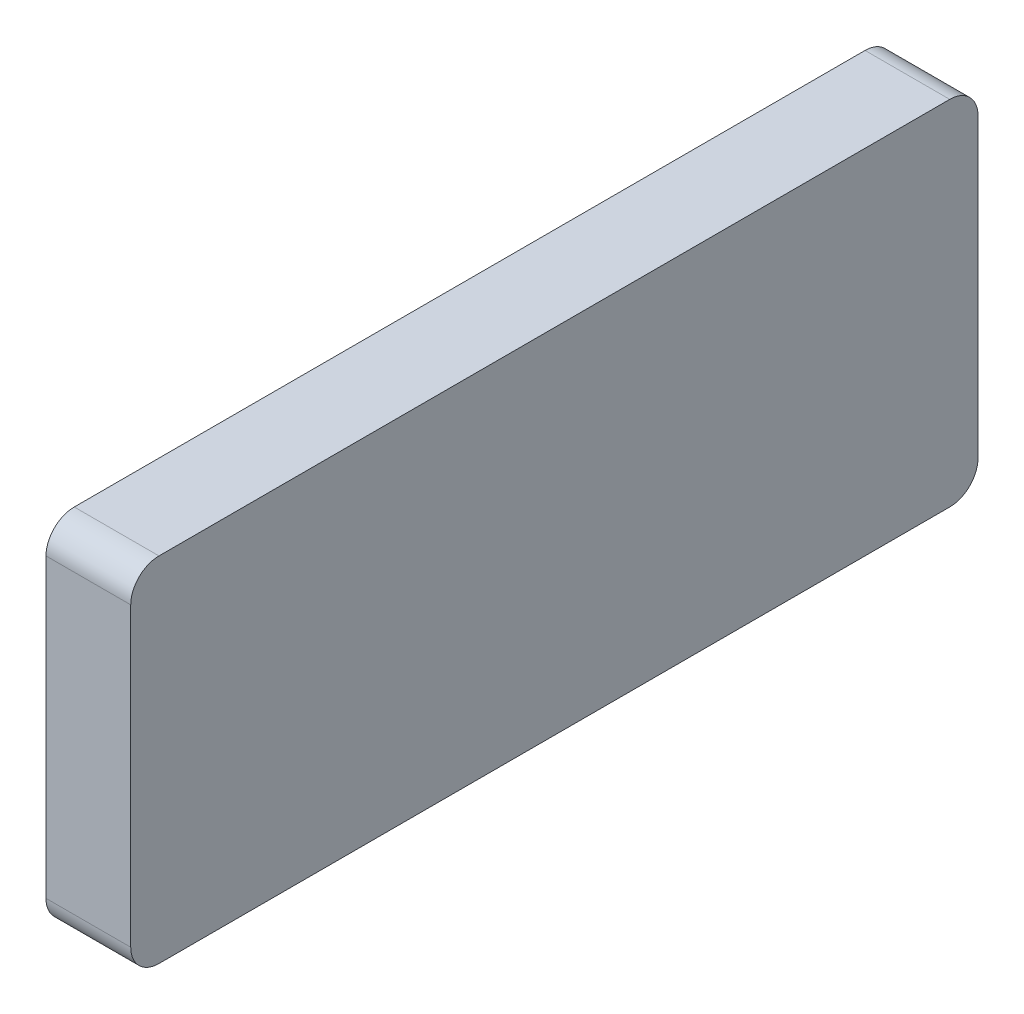
ISO-10303-21;
HEADER;
FILE_DESCRIPTION(('STEP AP214'),'2;1');
FILE_NAME('part.step','',(''),(''),'','','');
FILE_SCHEMA(('AUTOMOTIVE_DESIGN { 1 0 10303 214 1 1 1 1 }'));
ENDSEC;
DATA;
#1=APPLICATION_CONTEXT('core data for automotive mechanical design processes');
#2=APPLICATION_PROTOCOL_DEFINITION('international standard','automotive_design',2000,#1);
#3=PRODUCT_CONTEXT('',#1,'mechanical');
#4=PRODUCT('Part','Part','',(#3));
#5=PRODUCT_RELATED_PRODUCT_CATEGORY('part','',(#4));
#6=PRODUCT_DEFINITION_FORMATION('','',#4);
#7=PRODUCT_DEFINITION_CONTEXT('part definition',#1,'design');
#8=PRODUCT_DEFINITION('design','',#6,#7);
#9=PRODUCT_DEFINITION_SHAPE('','',#8);
#10=(LENGTH_UNIT() NAMED_UNIT(*) SI_UNIT(.MILLI.,.METRE.));
#11=(NAMED_UNIT(*) PLANE_ANGLE_UNIT() SI_UNIT($,.RADIAN.));
#12=(NAMED_UNIT(*) SI_UNIT($,.STERADIAN.) SOLID_ANGLE_UNIT());
#13=UNCERTAINTY_MEASURE_WITH_UNIT(LENGTH_MEASURE(1.E-05),#10,'distance_accuracy_value','');
#14=(GEOMETRIC_REPRESENTATION_CONTEXT(3) GLOBAL_UNCERTAINTY_ASSIGNED_CONTEXT((#13)) GLOBAL_UNIT_ASSIGNED_CONTEXT((#10,
#11,#12)) REPRESENTATION_CONTEXT('',''));
#15=CARTESIAN_POINT('',(0.,0.,0.));
#16=DIRECTION('',(0.,0.,1.));
#17=DIRECTION('',(1.,0.,0.));
#18=AXIS2_PLACEMENT_3D('',#15,#16,#17);
#19=CARTESIAN_POINT('',(6.,25.,0.));
#20=DIRECTION('',(0.,0.,-1.));
#21=DIRECTION('',(0.,1.,0.));
#22=AXIS2_PLACEMENT_3D('',#19,#20,#21);
#23=PLANE('',#22);
#24=DIRECTION('',(0.,-1.,0.));
#25=VECTOR('',#24,1.);
#26=CARTESIAN_POINT('',(0.,25.,0.));
#27=LINE('',#26,#25);
#28=CARTESIAN_POINT('',(0.,23.,0.));
#29=VERTEX_POINT('',#28);
#30=CARTESIAN_POINT('',(0.,2.,0.));
#31=VERTEX_POINT('',#30);
#32=EDGE_CURVE('E125',#29,#31,#27,.T.);
#33=ORIENTED_EDGE('',*,*,#32,.T.);
#34=DIRECTION('',(-1.,0.,0.));
#35=VECTOR('',#34,1.);
#36=CARTESIAN_POINT('',(6.,2.,0.));
#37=LINE('',#36,#35);
#38=CARTESIAN_POINT('',(6.,2.,0.));
#39=VERTEX_POINT('',#38);
#40=EDGE_CURVE('E103',#31,#39,#37,.F.);
#41=ORIENTED_EDGE('',*,*,#40,.T.);
#42=DIRECTION('',(0.,-1.,0.));
#43=VECTOR('',#42,1.);
#44=CARTESIAN_POINT('',(6.,25.,0.));
#45=LINE('',#44,#43);
#46=CARTESIAN_POINT('',(6.,23.,0.));
#47=VERTEX_POINT('',#46);
#48=EDGE_CURVE('E134',#47,#39,#45,.T.);
#49=ORIENTED_EDGE('',*,*,#48,.F.);
#50=DIRECTION('',(-1.,0.,0.));
#51=VECTOR('',#50,1.);
#52=CARTESIAN_POINT('',(6.,23.,0.));
#53=LINE('',#52,#51);
#54=EDGE_CURVE('E108',#47,#29,#53,.T.);
#55=ORIENTED_EDGE('',*,*,#54,.T.);
#56=EDGE_LOOP('',(#33,#41,#49,#55));
#57=FACE_BOUND('',#56,.T.);
#58=ADVANCED_FACE('F32',(#57),#23,.F.);
#59=CARTESIAN_POINT('',(6.,0.,0.));
#60=DIRECTION('',(0.,1.,0.));
#61=DIRECTION('',(0.,0.,1.));
#62=AXIS2_PLACEMENT_3D('',#59,#60,#61);
#63=PLANE('',#62);
#64=DIRECTION('',(0.,0.,-1.));
#65=VECTOR('',#64,1.);
#66=CARTESIAN_POINT('',(6.,0.,0.));
#67=LINE('',#66,#65);
#68=CARTESIAN_POINT('',(6.,0.,-2.));
#69=VERTEX_POINT('',#68);
#70=CARTESIAN_POINT('',(6.,0.,-58.));
#71=VERTEX_POINT('',#70);
#72=EDGE_CURVE('E118',#69,#71,#67,.T.);
#73=ORIENTED_EDGE('',*,*,#72,.F.);
#74=DIRECTION('',(-1.,0.,0.));
#75=VECTOR('',#74,1.);
#76=CARTESIAN_POINT('',(6.,0.,-2.));
#77=LINE('',#76,#75);
#78=CARTESIAN_POINT('',(0.,0.,-2.));
#79=VERTEX_POINT('',#78);
#80=EDGE_CURVE('E102',#69,#79,#77,.T.);
#81=ORIENTED_EDGE('',*,*,#80,.T.);
#82=DIRECTION('',(0.,0.,-1.));
#83=VECTOR('',#82,1.);
#84=CARTESIAN_POINT('',(0.,0.,0.));
#85=LINE('',#84,#83);
#86=CARTESIAN_POINT('',(0.,0.,-58.));
#87=VERTEX_POINT('',#86);
#88=EDGE_CURVE('E115',#79,#87,#85,.T.);
#89=ORIENTED_EDGE('',*,*,#88,.T.);
#90=DIRECTION('',(-1.,0.,0.));
#91=VECTOR('',#90,1.);
#92=CARTESIAN_POINT('',(6.,0.,-58.));
#93=LINE('',#92,#91);
#94=EDGE_CURVE('E120',#87,#71,#93,.F.);
#95=ORIENTED_EDGE('',*,*,#94,.T.);
#96=EDGE_LOOP('',(#73,#81,#89,#95));
#97=FACE_BOUND('',#96,.T.);
#98=ADVANCED_FACE('F114',(#97),#63,.F.);
#99=CARTESIAN_POINT('',(6.,0.,-60.));
#100=DIRECTION('',(0.,0.,1.));
#101=DIRECTION('',(1.,0.,0.));
#102=AXIS2_PLACEMENT_3D('',#99,#100,#101);
#103=PLANE('',#102);
#104=DIRECTION('',(0.,1.,0.));
#105=VECTOR('',#104,1.);
#106=CARTESIAN_POINT('',(6.,0.,-60.));
#107=LINE('',#106,#105);
#108=CARTESIAN_POINT('',(6.,2.,-60.));
#109=VERTEX_POINT('',#108);
#110=CARTESIAN_POINT('',(6.,23.,-60.));
#111=VERTEX_POINT('',#110);
#112=EDGE_CURVE('E160',#109,#111,#107,.T.);
#113=ORIENTED_EDGE('',*,*,#112,.F.);
#114=DIRECTION('',(-1.,0.,0.));
#115=VECTOR('',#114,1.);
#116=CARTESIAN_POINT('',(6.,2.,-60.));
#117=LINE('',#116,#115);
#118=CARTESIAN_POINT('',(0.,2.,-60.));
#119=VERTEX_POINT('',#118);
#120=EDGE_CURVE('E153',#109,#119,#117,.T.);
#121=ORIENTED_EDGE('',*,*,#120,.T.);
#122=DIRECTION('',(0.,1.,0.));
#123=VECTOR('',#122,1.);
#124=CARTESIAN_POINT('',(0.,0.,-60.));
#125=LINE('',#124,#123);
#126=CARTESIAN_POINT('',(0.,23.,-60.));
#127=VERTEX_POINT('',#126);
#128=EDGE_CURVE('E124',#119,#127,#125,.T.);
#129=ORIENTED_EDGE('',*,*,#128,.T.);
#130=DIRECTION('',(-1.,0.,0.));
#131=VECTOR('',#130,1.);
#132=CARTESIAN_POINT('',(6.,23.,-60.));
#133=LINE('',#132,#131);
#134=EDGE_CURVE('E151',#127,#111,#133,.F.);
#135=ORIENTED_EDGE('',*,*,#134,.T.);
#136=EDGE_LOOP('',(#113,#121,#129,#135));
#137=FACE_BOUND('',#136,.T.);
#138=ADVANCED_FACE('F158',(#137),#103,.F.);
#139=CARTESIAN_POINT('',(6.,25.,-60.));
#140=DIRECTION('',(0.,-1.,0.));
#141=DIRECTION('',(0.,0.,-1.));
#142=AXIS2_PLACEMENT_3D('',#139,#140,#141);
#143=PLANE('',#142);
#144=DIRECTION('',(0.,0.,1.));
#145=VECTOR('',#144,1.);
#146=CARTESIAN_POINT('',(6.,25.,-60.));
#147=LINE('',#146,#145);
#148=CARTESIAN_POINT('',(6.,25.,-58.));
#149=VERTEX_POINT('',#148);
#150=CARTESIAN_POINT('',(6.,25.,-2.00000000000002));
#151=VERTEX_POINT('',#150);
#152=EDGE_CURVE('E135',#149,#151,#147,.T.);
#153=ORIENTED_EDGE('',*,*,#152,.F.);
#154=DIRECTION('',(-1.,0.,0.));
#155=VECTOR('',#154,1.);
#156=CARTESIAN_POINT('',(6.,25.,-58.));
#157=LINE('',#156,#155);
#158=CARTESIAN_POINT('',(0.,25.,-58.));
#159=VERTEX_POINT('',#158);
#160=EDGE_CURVE('E11',#149,#159,#157,.T.);
#161=ORIENTED_EDGE('',*,*,#160,.T.);
#162=DIRECTION('',(0.,0.,1.));
#163=VECTOR('',#162,1.);
#164=CARTESIAN_POINT('',(0.,25.,-60.));
#165=LINE('',#164,#163);
#166=CARTESIAN_POINT('',(0.,25.,-2.00000000000002));
#167=VERTEX_POINT('',#166);
#168=EDGE_CURVE('E128',#159,#167,#165,.T.);
#169=ORIENTED_EDGE('',*,*,#168,.T.);
#170=DIRECTION('',(-1.,0.,0.));
#171=VECTOR('',#170,1.);
#172=CARTESIAN_POINT('',(6.,25.,-2.));
#173=LINE('',#172,#171);
#174=EDGE_CURVE('E40',#167,#151,#173,.F.);
#175=ORIENTED_EDGE('',*,*,#174,.T.);
#176=EDGE_LOOP('',(#153,#161,#169,#175));
#177=FACE_BOUND('',#176,.T.);
#178=ADVANCED_FACE('F167',(#177),#143,.F.);
#179=CARTESIAN_POINT('',(6.,0.,0.));
#180=DIRECTION('',(1.,0.,0.));
#181=DIRECTION('',(0.,0.,-1.));
#182=AXIS2_PLACEMENT_3D('',#179,#180,#181);
#183=PLANE('',#182);
#184=ORIENTED_EDGE('',*,*,#48,.T.);
#185=CARTESIAN_POINT('',(6.,2.,-2.));
#186=DIRECTION('',(1.,0.,0.));
#187=DIRECTION('',(0.,0.,-1.));
#188=AXIS2_PLACEMENT_3D('',#185,#186,#187);
#189=CIRCLE('',#188,2.);
#190=EDGE_CURVE('E149',#39,#69,#189,.T.);
#191=ORIENTED_EDGE('',*,*,#190,.T.);
#192=ORIENTED_EDGE('',*,*,#72,.T.);
#193=CARTESIAN_POINT('',(6.,2.,-58.));
#194=DIRECTION('',(1.,0.,0.));
#195=DIRECTION('',(0.,0.,-1.));
#196=AXIS2_PLACEMENT_3D('',#193,#194,#195);
#197=CIRCLE('',#196,2.);
#198=EDGE_CURVE('E147',#71,#109,#197,.T.);
#199=ORIENTED_EDGE('',*,*,#198,.T.);
#200=ORIENTED_EDGE('',*,*,#112,.T.);
#201=CARTESIAN_POINT('',(6.,23.,-58.));
#202=DIRECTION('',(1.,0.,0.));
#203=DIRECTION('',(0.,0.,-1.));
#204=AXIS2_PLACEMENT_3D('',#201,#202,#203);
#205=CIRCLE('',#204,2.);
#206=EDGE_CURVE('E53',#111,#149,#205,.T.);
#207=ORIENTED_EDGE('',*,*,#206,.T.);
#208=ORIENTED_EDGE('',*,*,#152,.T.);
#209=CARTESIAN_POINT('',(6.,23.,-2.));
#210=DIRECTION('',(1.,0.,0.));
#211=DIRECTION('',(0.,0.,-1.));
#212=AXIS2_PLACEMENT_3D('',#209,#210,#211);
#213=CIRCLE('',#212,2.);
#214=EDGE_CURVE('E144',#151,#47,#213,.T.);
#215=ORIENTED_EDGE('',*,*,#214,.T.);
#216=EDGE_LOOP('',(#184,#191,#192,#199,#200,#207,#208,#215));
#217=FACE_BOUND('',#216,.T.);
#218=ADVANCED_FACE('F174',(#217),#183,.T.);
#219=CARTESIAN_POINT('',(0.,0.,0.));
#220=DIRECTION('',(1.,0.,0.));
#221=DIRECTION('',(0.,0.,-1.));
#222=AXIS2_PLACEMENT_3D('',#219,#220,#221);
#223=PLANE('',#222);
#224=ORIENTED_EDGE('',*,*,#88,.F.);
#225=CARTESIAN_POINT('',(0.,2.,-2.));
#226=DIRECTION('',(1.,0.,0.));
#227=DIRECTION('',(0.,0.,-1.));
#228=AXIS2_PLACEMENT_3D('',#225,#226,#227);
#229=CIRCLE('',#228,2.);
#230=EDGE_CURVE('E98',#79,#31,#229,.F.);
#231=ORIENTED_EDGE('',*,*,#230,.T.);
#232=ORIENTED_EDGE('',*,*,#32,.F.);
#233=CARTESIAN_POINT('',(0.,23.,-2.));
#234=DIRECTION('',(1.,0.,0.));
#235=DIRECTION('',(0.,0.,-1.));
#236=AXIS2_PLACEMENT_3D('',#233,#234,#235);
#237=CIRCLE('',#236,2.);
#238=EDGE_CURVE('E119',#29,#167,#237,.F.);
#239=ORIENTED_EDGE('',*,*,#238,.T.);
#240=ORIENTED_EDGE('',*,*,#168,.F.);
#241=CARTESIAN_POINT('',(0.,23.,-58.));
#242=DIRECTION('',(1.,0.,0.));
#243=DIRECTION('',(0.,0.,-1.));
#244=AXIS2_PLACEMENT_3D('',#241,#242,#243);
#245=CIRCLE('',#244,2.);
#246=EDGE_CURVE('E138',#159,#127,#245,.F.);
#247=ORIENTED_EDGE('',*,*,#246,.T.);
#248=ORIENTED_EDGE('',*,*,#128,.F.);
#249=CARTESIAN_POINT('',(0.,2.,-58.));
#250=DIRECTION('',(1.,0.,0.));
#251=DIRECTION('',(0.,0.,-1.));
#252=AXIS2_PLACEMENT_3D('',#249,#250,#251);
#253=CIRCLE('',#252,2.);
#254=EDGE_CURVE('E109',#119,#87,#253,.F.);
#255=ORIENTED_EDGE('',*,*,#254,.T.);
#256=EDGE_LOOP('',(#224,#231,#232,#239,#240,#247,#248,#255));
#257=FACE_BOUND('',#256,.T.);
#258=ADVANCED_FACE('F122',(#257),#223,.F.);
#259=CARTESIAN_POINT('',(6.,2.,-2.));
#260=DIRECTION('',(-1.,0.,0.));
#261=DIRECTION('',(0.,0.,1.));
#262=AXIS2_PLACEMENT_3D('',#259,#260,#261);
#263=CYLINDRICAL_SURFACE('',#262,2.);
#264=ORIENTED_EDGE('',*,*,#190,.F.);
#265=ORIENTED_EDGE('',*,*,#40,.F.);
#266=ORIENTED_EDGE('',*,*,#230,.F.);
#267=ORIENTED_EDGE('',*,*,#80,.F.);
#268=EDGE_LOOP('',(#264,#265,#266,#267));
#269=FACE_BOUND('',#268,.T.);
#270=ADVANCED_FACE('F101',(#269),#263,.T.);
#271=CARTESIAN_POINT('',(6.,2.,-58.));
#272=DIRECTION('',(-1.,0.,0.));
#273=DIRECTION('',(0.,0.,1.));
#274=AXIS2_PLACEMENT_3D('',#271,#272,#273);
#275=CYLINDRICAL_SURFACE('',#274,2.);
#276=ORIENTED_EDGE('',*,*,#198,.F.);
#277=ORIENTED_EDGE('',*,*,#94,.F.);
#278=ORIENTED_EDGE('',*,*,#254,.F.);
#279=ORIENTED_EDGE('',*,*,#120,.F.);
#280=EDGE_LOOP('',(#276,#277,#278,#279));
#281=FACE_BOUND('',#280,.T.);
#282=ADVANCED_FACE('F182',(#281),#275,.T.);
#283=CARTESIAN_POINT('',(6.,23.,-58.));
#284=DIRECTION('',(-1.,0.,0.));
#285=DIRECTION('',(0.,0.,1.));
#286=AXIS2_PLACEMENT_3D('',#283,#284,#285);
#287=CYLINDRICAL_SURFACE('',#286,2.);
#288=ORIENTED_EDGE('',*,*,#206,.F.);
#289=ORIENTED_EDGE('',*,*,#134,.F.);
#290=ORIENTED_EDGE('',*,*,#246,.F.);
#291=ORIENTED_EDGE('',*,*,#160,.F.);
#292=EDGE_LOOP('',(#288,#289,#290,#291));
#293=FACE_BOUND('',#292,.T.);
#294=ADVANCED_FACE('F166',(#293),#287,.T.);
#295=CARTESIAN_POINT('',(6.,23.,-2.));
#296=DIRECTION('',(-1.,0.,0.));
#297=DIRECTION('',(0.,0.,1.));
#298=AXIS2_PLACEMENT_3D('',#295,#296,#297);
#299=CYLINDRICAL_SURFACE('',#298,2.);
#300=ORIENTED_EDGE('',*,*,#214,.F.);
#301=ORIENTED_EDGE('',*,*,#174,.F.);
#302=ORIENTED_EDGE('',*,*,#238,.F.);
#303=ORIENTED_EDGE('',*,*,#54,.F.);
#304=EDGE_LOOP('',(#300,#301,#302,#303));
#305=FACE_BOUND('',#304,.T.);
#306=ADVANCED_FACE('F34',(#305),#299,.T.);
#307=CLOSED_SHELL('',(#58,#98,#138,#178,#218,#258,#270,#282,#294,#306));
#308=MANIFOLD_SOLID_BREP('B2',#307);
#309=ADVANCED_BREP_SHAPE_REPRESENTATION('',(#18,#308),#14);
#310=SHAPE_DEFINITION_REPRESENTATION(#9,#309);
ENDSEC;
END-ISO-10303-21;
